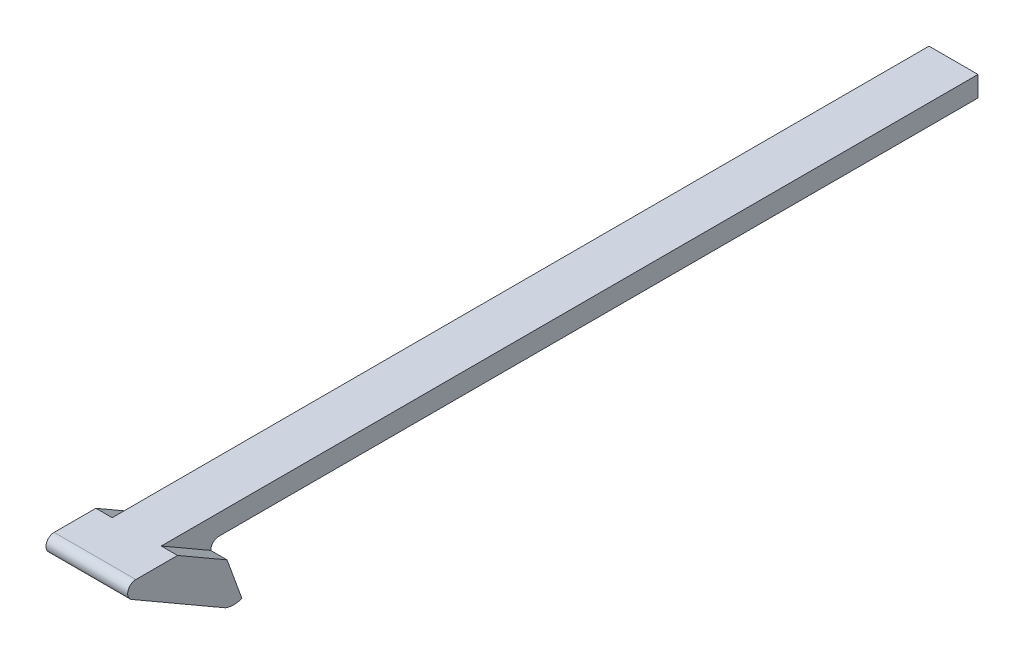
ISO-10303-21;
HEADER;
FILE_DESCRIPTION(('STEP AP214'),'2;1');
FILE_NAME('part.step','',(''),(''),'','','');
FILE_SCHEMA(('AUTOMOTIVE_DESIGN { 1 0 10303 214 1 1 1 1 }'));
ENDSEC;
DATA;
#1=APPLICATION_CONTEXT('core data for automotive mechanical design processes');
#2=APPLICATION_PROTOCOL_DEFINITION('international standard','automotive_design',2000,#1);
#3=PRODUCT_CONTEXT('',#1,'mechanical');
#4=PRODUCT('Part','Part','',(#3));
#5=PRODUCT_RELATED_PRODUCT_CATEGORY('part','',(#4));
#6=PRODUCT_DEFINITION_FORMATION('','',#4);
#7=PRODUCT_DEFINITION_CONTEXT('part definition',#1,'design');
#8=PRODUCT_DEFINITION('design','',#6,#7);
#9=PRODUCT_DEFINITION_SHAPE('','',#8);
#10=(LENGTH_UNIT() NAMED_UNIT(*) SI_UNIT(.MILLI.,.METRE.));
#11=(NAMED_UNIT(*) PLANE_ANGLE_UNIT() SI_UNIT($,.RADIAN.));
#12=(NAMED_UNIT(*) SI_UNIT($,.STERADIAN.) SOLID_ANGLE_UNIT());
#13=UNCERTAINTY_MEASURE_WITH_UNIT(LENGTH_MEASURE(1.E-05),#10,'distance_accuracy_value','');
#14=(GEOMETRIC_REPRESENTATION_CONTEXT(3) GLOBAL_UNCERTAINTY_ASSIGNED_CONTEXT((#13)) GLOBAL_UNIT_ASSIGNED_CONTEXT((#10,
#11,#12)) REPRESENTATION_CONTEXT('',''));
#15=CARTESIAN_POINT('',(0.,0.,0.));
#16=DIRECTION('',(0.,0.,1.));
#17=DIRECTION('',(1.,0.,0.));
#18=AXIS2_PLACEMENT_3D('',#15,#16,#17);
#19=CARTESIAN_POINT('',(5.,0.,0.));
#20=DIRECTION('',(0.,-0.866025403784442,0.499999999999995));
#21=DIRECTION('',(0.,-0.499999999999995,-0.866025403784442));
#22=AXIS2_PLACEMENT_3D('',#19,#20,#21);
#23=PLANE('',#22);
#24=DIRECTION('',(-1.,0.,0.));
#25=VECTOR('',#24,1.);
#26=CARTESIAN_POINT('',(5.,-3.5,-6.06217782649116));
#27=LINE('',#26,#25);
#28=CARTESIAN_POINT('',(5.,-3.5,-6.06217782649116));
#29=VERTEX_POINT('',#28);
#30=CARTESIAN_POINT('',(3.,-3.5,-6.06217782649116));
#31=VERTEX_POINT('',#30);
#32=EDGE_CURVE('E165',#29,#31,#27,.T.);
#33=ORIENTED_EDGE('',*,*,#32,.T.);
#34=DIRECTION('',(0.,-0.499999999999995,-0.866025403784442));
#35=VECTOR('',#34,1.);
#36=CARTESIAN_POINT('',(3.,0.,0.));
#37=LINE('',#36,#35);
#38=CARTESIAN_POINT('',(3.,0.,0.));
#39=VERTEX_POINT('',#38);
#40=EDGE_CURVE('E159',#39,#31,#37,.T.);
#41=ORIENTED_EDGE('',*,*,#40,.F.);
#42=DIRECTION('',(-1.,0.,0.));
#43=VECTOR('',#42,1.);
#44=CARTESIAN_POINT('',(5.,0.,0.));
#45=LINE('',#44,#43);
#46=CARTESIAN_POINT('',(5.,0.,0.));
#47=VERTEX_POINT('',#46);
#48=EDGE_CURVE('E235',#47,#39,#45,.T.);
#49=ORIENTED_EDGE('',*,*,#48,.F.);
#50=DIRECTION('',(0.,0.499999999999995,0.866025403784442));
#51=VECTOR('',#50,1.);
#52=CARTESIAN_POINT('',(5.,0.,0.));
#53=LINE('',#52,#51);
#54=EDGE_CURVE('E395',#29,#47,#53,.T.);
#55=ORIENTED_EDGE('',*,*,#54,.F.);
#56=EDGE_LOOP('',(#33,#41,#49,#55));
#57=FACE_BOUND('',#56,.T.);
#58=ADVANCED_FACE('F43',(#57),#23,.F.);
#59=CARTESIAN_POINT('',(3.,-2.5,0.));
#60=DIRECTION('',(0.,1.,0.));
#61=DIRECTION('',(0.,0.,1.));
#62=AXIS2_PLACEMENT_3D('',#59,#60,#61);
#63=PLANE('',#62);
#64=DIRECTION('',(0.,0.,-1.));
#65=VECTOR('',#64,1.);
#66=CARTESIAN_POINT('',(3.,-2.5,0.));
#67=LINE('',#66,#65);
#68=CARTESIAN_POINT('',(3.,-2.5,-7.06217782649116));
#69=VERTEX_POINT('',#68);
#70=CARTESIAN_POINT('',(3.,-2.5,-100.));
#71=VERTEX_POINT('',#70);
#72=EDGE_CURVE('E172',#69,#71,#67,.T.);
#73=ORIENTED_EDGE('',*,*,#72,.F.);
#74=DIRECTION('',(-1.,0.,0.));
#75=VECTOR('',#74,1.);
#76=CARTESIAN_POINT('',(3.,-2.5,-7.06217782649116));
#77=LINE('',#76,#75);
#78=CARTESIAN_POINT('',(-3.,-2.5,-7.06217782649116));
#79=VERTEX_POINT('',#78);
#80=EDGE_CURVE('E198',#69,#79,#77,.T.);
#81=ORIENTED_EDGE('',*,*,#80,.T.);
#82=DIRECTION('',(0.,0.,-1.));
#83=VECTOR('',#82,1.);
#84=CARTESIAN_POINT('',(-3.,-2.5,0.));
#85=LINE('',#84,#83);
#86=CARTESIAN_POINT('',(-3.,-2.5,-100.));
#87=VERTEX_POINT('',#86);
#88=EDGE_CURVE('E183',#79,#87,#85,.T.);
#89=ORIENTED_EDGE('',*,*,#88,.T.);
#90=DIRECTION('',(-1.,0.,0.));
#91=VECTOR('',#90,1.);
#92=CARTESIAN_POINT('',(3.,-2.5,-100.));
#93=LINE('',#92,#91);
#94=EDGE_CURVE('E191',#71,#87,#93,.T.);
#95=ORIENTED_EDGE('',*,*,#94,.F.);
#96=EDGE_LOOP('',(#73,#81,#89,#95));
#97=FACE_BOUND('',#96,.T.);
#98=ADVANCED_FACE('F266',(#97),#63,.F.);
#99=CARTESIAN_POINT('',(3.,0.,0.));
#100=DIRECTION('',(1.,0.,0.));
#101=DIRECTION('',(0.,0.,-1.));
#102=AXIS2_PLACEMENT_3D('',#99,#100,#101);
#103=PLANE('',#102);
#104=DIRECTION('',(0.,0.,1.));
#105=VECTOR('',#104,1.);
#106=CARTESIAN_POINT('',(3.,0.,-100.));
#107=LINE('',#106,#105);
#108=CARTESIAN_POINT('',(3.,0.,-100.));
#109=VERTEX_POINT('',#108);
#110=EDGE_CURVE('E169',#109,#39,#107,.T.);
#111=ORIENTED_EDGE('',*,*,#110,.T.);
#112=ORIENTED_EDGE('',*,*,#40,.T.);
#113=CARTESIAN_POINT('',(3.,-3.5,-7.06217782649116));
#114=DIRECTION('',(1.,0.,0.));
#115=DIRECTION('',(0.,0.,-1.));
#116=AXIS2_PLACEMENT_3D('',#113,#114,#115);
#117=CIRCLE('',#116,1.);
#118=EDGE_CURVE('E201',#31,#69,#117,.F.);
#119=ORIENTED_EDGE('',*,*,#118,.T.);
#120=ORIENTED_EDGE('',*,*,#72,.T.);
#121=DIRECTION('',(0.,1.,0.));
#122=VECTOR('',#121,1.);
#123=CARTESIAN_POINT('',(3.,-2.5,-100.));
#124=LINE('',#123,#122);
#125=EDGE_CURVE('E176',#71,#109,#124,.T.);
#126=ORIENTED_EDGE('',*,*,#125,.T.);
#127=EDGE_LOOP('',(#111,#112,#119,#120,#126));
#128=FACE_BOUND('',#127,.T.);
#129=ADVANCED_FACE('F271',(#128),#103,.T.);
#130=CARTESIAN_POINT('',(-3.,0.,0.));
#131=DIRECTION('',(1.,0.,0.));
#132=DIRECTION('',(0.,0.,-1.));
#133=AXIS2_PLACEMENT_3D('',#130,#131,#132);
#134=PLANE('',#133);
#135=DIRECTION('',(0.,-0.499999999999995,-0.866025403784442));
#136=VECTOR('',#135,1.);
#137=CARTESIAN_POINT('',(-3.,0.,0.));
#138=LINE('',#137,#136);
#139=CARTESIAN_POINT('',(-3.,0.,0.));
#140=VERTEX_POINT('',#139);
#141=CARTESIAN_POINT('',(-3.,-3.5,-6.06217782649116));
#142=VERTEX_POINT('',#141);
#143=EDGE_CURVE('E195',#140,#142,#138,.T.);
#144=ORIENTED_EDGE('',*,*,#143,.F.);
#145=DIRECTION('',(0.,0.,1.));
#146=VECTOR('',#145,1.);
#147=CARTESIAN_POINT('',(-3.,0.,-100.));
#148=LINE('',#147,#146);
#149=CARTESIAN_POINT('',(-3.,0.,-100.));
#150=VERTEX_POINT('',#149);
#151=EDGE_CURVE('E163',#150,#140,#148,.T.);
#152=ORIENTED_EDGE('',*,*,#151,.F.);
#153=DIRECTION('',(0.,1.,0.));
#154=VECTOR('',#153,1.);
#155=CARTESIAN_POINT('',(-3.,-2.5,-100.));
#156=LINE('',#155,#154);
#157=EDGE_CURVE('E173',#87,#150,#156,.T.);
#158=ORIENTED_EDGE('',*,*,#157,.F.);
#159=ORIENTED_EDGE('',*,*,#88,.F.);
#160=CARTESIAN_POINT('',(-3.,-3.5,-7.06217782649116));
#161=DIRECTION('',(1.,0.,0.));
#162=DIRECTION('',(0.,0.,-1.));
#163=AXIS2_PLACEMENT_3D('',#160,#161,#162);
#164=CIRCLE('',#163,1.);
#165=EDGE_CURVE('E204',#79,#142,#164,.T.);
#166=ORIENTED_EDGE('',*,*,#165,.T.);
#167=EDGE_LOOP('',(#144,#152,#158,#159,#166));
#168=FACE_BOUND('',#167,.T.);
#169=ADVANCED_FACE('F292',(#168),#134,.F.);
#170=CARTESIAN_POINT('',(3.,0.,-100.));
#171=DIRECTION('',(0.,-1.,0.));
#172=DIRECTION('',(0.,0.,-1.));
#173=AXIS2_PLACEMENT_3D('',#170,#171,#172);
#174=PLANE('',#173);
#175=DIRECTION('',(0.,0.,1.));
#176=VECTOR('',#175,1.);
#177=CARTESIAN_POINT('',(-5.,0.,0.));
#178=LINE('',#177,#176);
#179=CARTESIAN_POINT('',(-5.,0.,0.));
#180=VERTEX_POINT('',#179);
#181=CARTESIAN_POINT('',(-5.,0.,5.10835205894461));
#182=VERTEX_POINT('',#181);
#183=EDGE_CURVE('E143',#180,#182,#178,.T.);
#184=ORIENTED_EDGE('',*,*,#183,.T.);
#185=DIRECTION('',(-1.,0.,0.));
#186=VECTOR('',#185,1.);
#187=CARTESIAN_POINT('',(3.,0.,5.10835205894461));
#188=LINE('',#187,#186);
#189=CARTESIAN_POINT('',(5.,0.,5.10835205894461));
#190=VERTEX_POINT('',#189);
#191=EDGE_CURVE('E52',#182,#190,#188,.F.);
#192=ORIENTED_EDGE('',*,*,#191,.T.);
#193=DIRECTION('',(0.,0.,1.));
#194=VECTOR('',#193,1.);
#195=CARTESIAN_POINT('',(5.,0.,0.));
#196=LINE('',#195,#194);
#197=EDGE_CURVE('E223',#47,#190,#196,.T.);
#198=ORIENTED_EDGE('',*,*,#197,.F.);
#199=ORIENTED_EDGE('',*,*,#48,.T.);
#200=ORIENTED_EDGE('',*,*,#110,.F.);
#201=DIRECTION('',(-1.,0.,0.));
#202=VECTOR('',#201,1.);
#203=CARTESIAN_POINT('',(3.,0.,-100.));
#204=LINE('',#203,#202);
#205=EDGE_CURVE('E179',#109,#150,#204,.T.);
#206=ORIENTED_EDGE('',*,*,#205,.T.);
#207=ORIENTED_EDGE('',*,*,#151,.T.);
#208=EDGE_CURVE('E239',#140,#180,#45,.T.);
#209=ORIENTED_EDGE('',*,*,#208,.T.);
#210=EDGE_LOOP('',(#184,#192,#198,#199,#200,#206,#207,#209));
#211=FACE_BOUND('',#210,.T.);
#212=ADVANCED_FACE('F258',(#211),#174,.F.);
#213=CARTESIAN_POINT('',(3.,-2.5,-100.));
#214=DIRECTION('',(0.,0.,1.));
#215=DIRECTION('',(1.,0.,0.));
#216=AXIS2_PLACEMENT_3D('',#213,#214,#215);
#217=PLANE('',#216);
#218=ORIENTED_EDGE('',*,*,#157,.T.);
#219=ORIENTED_EDGE('',*,*,#205,.F.);
#220=ORIENTED_EDGE('',*,*,#125,.F.);
#221=ORIENTED_EDGE('',*,*,#94,.T.);
#222=EDGE_LOOP('',(#218,#219,#220,#221));
#223=FACE_BOUND('',#222,.T.);
#224=ADVANCED_FACE('F289',(#223),#217,.F.);
#225=CARTESIAN_POINT('',(5.,0.,8.84040286651353));
#226=DIRECTION('',(0.,0.866025403784442,-0.499999999999995));
#227=DIRECTION('',(0.,0.499999999999995,0.866025403784442));
#228=AXIS2_PLACEMENT_3D('',#225,#226,#227);
#229=PLANE('',#228);
#230=DIRECTION('',(0.,-0.499999999999995,-0.866025403784442));
#231=VECTOR('',#230,1.);
#232=CARTESIAN_POINT('',(5.,0.,8.84040286651353));
#233=LINE('',#232,#231);
#234=CARTESIAN_POINT('',(5.,-1.86602540378444,5.6083520589446));
#235=VERTEX_POINT('',#234);
#236=CARTESIAN_POINT('',(5.,-8.5,-5.88202899782214));
#237=VERTEX_POINT('',#236);
#238=EDGE_CURVE('E132',#235,#237,#233,.T.);
#239=ORIENTED_EDGE('',*,*,#238,.F.);
#240=DIRECTION('',(-1.,0.,0.));
#241=VECTOR('',#240,1.);
#242=CARTESIAN_POINT('',(5.,-1.86602540378444,5.6083520589446));
#243=LINE('',#242,#241);
#244=CARTESIAN_POINT('',(-5.,-1.86602540378444,5.6083520589446));
#245=VERTEX_POINT('',#244);
#246=EDGE_CURVE('E208',#235,#245,#243,.T.);
#247=ORIENTED_EDGE('',*,*,#246,.T.);
#248=DIRECTION('',(0.,-0.499999999999995,-0.866025403784442));
#249=VECTOR('',#248,1.);
#250=CARTESIAN_POINT('',(-5.,0.,8.84040286651353));
#251=LINE('',#250,#249);
#252=CARTESIAN_POINT('',(-5.,-8.5,-5.88202899782214));
#253=VERTEX_POINT('',#252);
#254=EDGE_CURVE('E156',#245,#253,#251,.T.);
#255=ORIENTED_EDGE('',*,*,#254,.T.);
#256=DIRECTION('',(-1.,0.,0.));
#257=VECTOR('',#256,1.);
#258=CARTESIAN_POINT('',(5.,-8.5,-5.88202899782214));
#259=LINE('',#258,#257);
#260=EDGE_CURVE('E148',#237,#253,#259,.T.);
#261=ORIENTED_EDGE('',*,*,#260,.F.);
#262=EDGE_LOOP('',(#239,#247,#255,#261));
#263=FACE_BOUND('',#262,.T.);
#264=ADVANCED_FACE('F155',(#263),#229,.F.);
#265=CARTESIAN_POINT('',(5.,-5.67157287525381,-6.88202899782214));
#266=DIRECTION('',(-1.,0.,0.));
#267=DIRECTION('',(0.,0.,1.));
#268=AXIS2_PLACEMENT_3D('',#265,#266,#267);
#269=CYLINDRICAL_SURFACE('',#268,3.);
#270=CARTESIAN_POINT('',(-5.,-5.67157287525381,-6.88202899782214));
#271=DIRECTION('',(1.,0.,0.));
#272=DIRECTION('',(0.,0.,-1.));
#273=AXIS2_PLACEMENT_3D('',#270,#271,#272);
#274=CIRCLE('',#273,3.);
#275=CARTESIAN_POINT('',(-5.,-8.5,-7.88202899782214));
#276=VERTEX_POINT('',#275);
#277=EDGE_CURVE('E216',#253,#276,#274,.T.);
#278=ORIENTED_EDGE('',*,*,#277,.T.);
#279=DIRECTION('',(-1.,0.,0.));
#280=VECTOR('',#279,1.);
#281=CARTESIAN_POINT('',(5.,-8.5,-7.88202899782214));
#282=LINE('',#281,#280);
#283=CARTESIAN_POINT('',(5.,-8.5,-7.88202899782214));
#284=VERTEX_POINT('',#283);
#285=EDGE_CURVE('E150',#284,#276,#282,.T.);
#286=ORIENTED_EDGE('',*,*,#285,.F.);
#287=CARTESIAN_POINT('',(5.,-5.67157287525381,-6.88202899782214));
#288=DIRECTION('',(1.,0.,0.));
#289=DIRECTION('',(0.,0.,-1.));
#290=AXIS2_PLACEMENT_3D('',#287,#288,#289);
#291=CIRCLE('',#290,3.);
#292=EDGE_CURVE('E135',#237,#284,#291,.T.);
#293=ORIENTED_EDGE('',*,*,#292,.F.);
#294=ORIENTED_EDGE('',*,*,#260,.T.);
#295=EDGE_LOOP('',(#278,#286,#293,#294));
#296=FACE_BOUND('',#295,.T.);
#297=ADVANCED_FACE('F147',(#296),#269,.T.);
#298=CARTESIAN_POINT('',(5.,-8.5,-7.88202899782214));
#299=DIRECTION('',(0.,-0.342020143325663,0.93969262078591));
#300=DIRECTION('',(0.,-0.93969262078591,-0.342020143325663));
#301=AXIS2_PLACEMENT_3D('',#298,#299,#300);
#302=PLANE('',#301);
#303=DIRECTION('',(0.,0.93969262078591,0.342020143325663));
#304=VECTOR('',#303,1.);
#305=CARTESIAN_POINT('',(-5.,-8.5,-7.88202899782214));
#306=LINE('',#305,#304);
#307=CARTESIAN_POINT('',(-5.,-3.5,-6.06217782649116));
#308=VERTEX_POINT('',#307);
#309=EDGE_CURVE('E220',#276,#308,#306,.T.);
#310=ORIENTED_EDGE('',*,*,#309,.T.);
#311=EDGE_CURVE('E238',#142,#308,#27,.T.);
#312=ORIENTED_EDGE('',*,*,#311,.F.);
#313=EDGE_CURVE('E242',#31,#142,#27,.T.);
#314=ORIENTED_EDGE('',*,*,#313,.F.);
#315=ORIENTED_EDGE('',*,*,#32,.F.);
#316=DIRECTION('',(0.,0.93969262078591,0.342020143325663));
#317=VECTOR('',#316,1.);
#318=CARTESIAN_POINT('',(5.,-8.5,-7.88202899782214));
#319=LINE('',#318,#317);
#320=EDGE_CURVE('E153',#284,#29,#319,.T.);
#321=ORIENTED_EDGE('',*,*,#320,.F.);
#322=ORIENTED_EDGE('',*,*,#285,.T.);
#323=EDGE_LOOP('',(#310,#312,#314,#315,#321,#322));
#324=FACE_BOUND('',#323,.T.);
#325=ADVANCED_FACE('F257',(#324),#302,.F.);
#326=ORIENTED_EDGE('',*,*,#143,.T.);
#327=ORIENTED_EDGE('',*,*,#311,.T.);
#328=DIRECTION('',(0.,0.499999999999995,0.866025403784442));
#329=VECTOR('',#328,1.);
#330=CARTESIAN_POINT('',(-5.,0.,0.));
#331=LINE('',#330,#329);
#332=EDGE_CURVE('E229',#308,#180,#331,.T.);
#333=ORIENTED_EDGE('',*,*,#332,.T.);
#334=ORIENTED_EDGE('',*,*,#208,.F.);
#335=EDGE_LOOP('',(#326,#327,#333,#334));
#336=FACE_BOUND('',#335,.T.);
#337=ADVANCED_FACE('F252',(#336),#23,.F.);
#338=CARTESIAN_POINT('',(5.,-5.67157287525381,-6.88202899782214));
#339=DIRECTION('',(1.,0.,0.));
#340=DIRECTION('',(0.,0.,-1.));
#341=AXIS2_PLACEMENT_3D('',#338,#339,#340);
#342=PLANE('',#341);
#343=ORIENTED_EDGE('',*,*,#197,.T.);
#344=CARTESIAN_POINT('',(5.,-1.,5.10835205894461));
#345=DIRECTION('',(1.,0.,0.));
#346=DIRECTION('',(0.,0.,-1.));
#347=AXIS2_PLACEMENT_3D('',#344,#345,#346);
#348=CIRCLE('',#347,1.);
#349=EDGE_CURVE('E11',#190,#235,#348,.T.);
#350=ORIENTED_EDGE('',*,*,#349,.T.);
#351=ORIENTED_EDGE('',*,*,#238,.T.);
#352=ORIENTED_EDGE('',*,*,#292,.T.);
#353=ORIENTED_EDGE('',*,*,#320,.T.);
#354=ORIENTED_EDGE('',*,*,#54,.T.);
#355=EDGE_LOOP('',(#343,#350,#351,#352,#353,#354));
#356=FACE_BOUND('',#355,.T.);
#357=ADVANCED_FACE('F134',(#356),#342,.T.);
#358=CARTESIAN_POINT('',(-5.,-5.67157287525381,-6.88202899782214));
#359=DIRECTION('',(1.,0.,0.));
#360=DIRECTION('',(0.,0.,-1.));
#361=AXIS2_PLACEMENT_3D('',#358,#359,#360);
#362=PLANE('',#361);
#363=ORIENTED_EDGE('',*,*,#254,.F.);
#364=CARTESIAN_POINT('',(-5.,-1.,5.10835205894461));
#365=DIRECTION('',(1.,0.,0.));
#366=DIRECTION('',(0.,0.,-1.));
#367=AXIS2_PLACEMENT_3D('',#364,#365,#366);
#368=CIRCLE('',#367,1.);
#369=EDGE_CURVE('E66',#245,#182,#368,.F.);
#370=ORIENTED_EDGE('',*,*,#369,.T.);
#371=ORIENTED_EDGE('',*,*,#183,.F.);
#372=ORIENTED_EDGE('',*,*,#332,.F.);
#373=ORIENTED_EDGE('',*,*,#309,.F.);
#374=ORIENTED_EDGE('',*,*,#277,.F.);
#375=EDGE_LOOP('',(#363,#370,#371,#372,#373,#374));
#376=FACE_BOUND('',#375,.T.);
#377=ADVANCED_FACE('F214',(#376),#362,.F.);
#378=CARTESIAN_POINT('',(5.,-3.5,-7.06217782649116));
#379=DIRECTION('',(-1.,0.,0.));
#380=DIRECTION('',(0.,0.,1.));
#381=AXIS2_PLACEMENT_3D('',#378,#379,#380);
#382=CYLINDRICAL_SURFACE('',#381,1.);
#383=ORIENTED_EDGE('',*,*,#165,.F.);
#384=ORIENTED_EDGE('',*,*,#80,.F.);
#385=ORIENTED_EDGE('',*,*,#118,.F.);
#386=ORIENTED_EDGE('',*,*,#313,.T.);
#387=EDGE_LOOP('',(#383,#384,#385,#386));
#388=FACE_BOUND('',#387,.T.);
#389=ADVANCED_FACE('F260',(#388),#382,.F.);
#390=CARTESIAN_POINT('',(5.,-1.,5.10835205894461));
#391=DIRECTION('',(-1.,0.,0.));
#392=DIRECTION('',(0.,0.,1.));
#393=AXIS2_PLACEMENT_3D('',#390,#391,#392);
#394=CYLINDRICAL_SURFACE('',#393,1.);
#395=ORIENTED_EDGE('',*,*,#349,.F.);
#396=ORIENTED_EDGE('',*,*,#191,.F.);
#397=ORIENTED_EDGE('',*,*,#369,.F.);
#398=ORIENTED_EDGE('',*,*,#246,.F.);
#399=EDGE_LOOP('',(#395,#396,#397,#398));
#400=FACE_BOUND('',#399,.T.);
#401=ADVANCED_FACE('F45',(#400),#394,.T.);
#402=CLOSED_SHELL('',(#58,#98,#129,#169,#212,#224,#264,#297,#325,#337,#357,#377,#389,#401));
#403=MANIFOLD_SOLID_BREP('B2',#402);
#404=ADVANCED_BREP_SHAPE_REPRESENTATION('',(#18,#403),#14);
#405=SHAPE_DEFINITION_REPRESENTATION(#9,#404);
ENDSEC;
END-ISO-10303-21;
